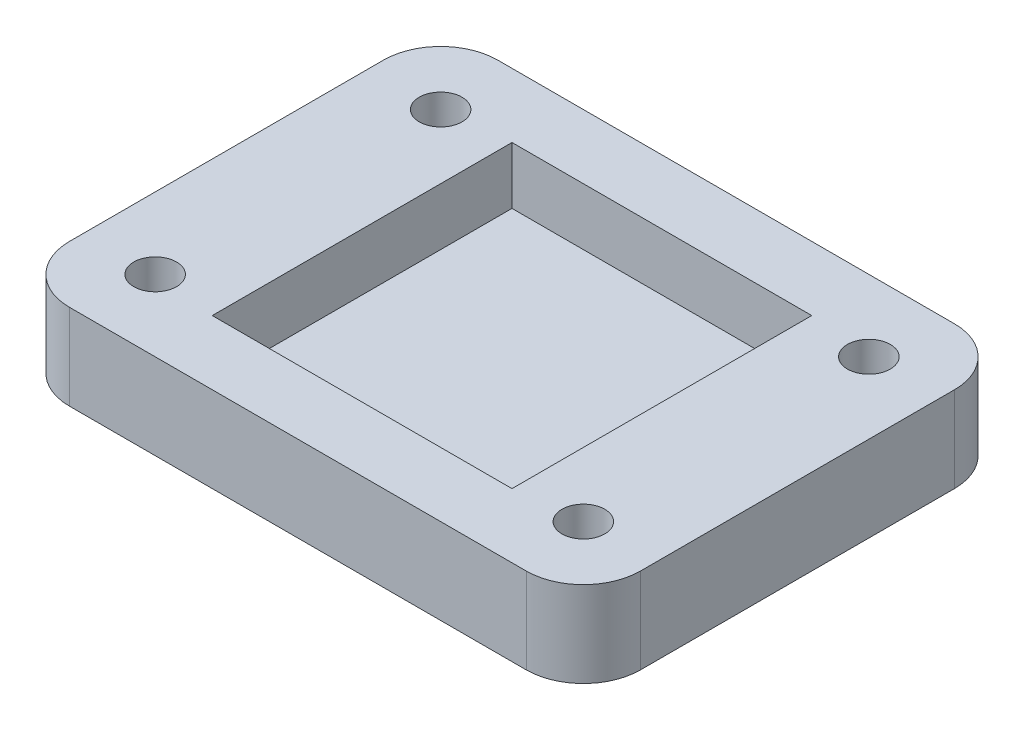
ISO-10303-21;
HEADER;
FILE_DESCRIPTION(('STEP AP214'),'2;1');
FILE_NAME('part.step','',(''),(''),'','','');
FILE_SCHEMA(('AUTOMOTIVE_DESIGN { 1 0 10303 214 1 1 1 1 }'));
ENDSEC;
DATA;
#1=APPLICATION_CONTEXT('core data for automotive mechanical design processes');
#2=APPLICATION_PROTOCOL_DEFINITION('international standard','automotive_design',2000,#1);
#3=PRODUCT_CONTEXT('',#1,'mechanical');
#4=PRODUCT('Part','Part','',(#3));
#5=PRODUCT_RELATED_PRODUCT_CATEGORY('part','',(#4));
#6=PRODUCT_DEFINITION_FORMATION('','',#4);
#7=PRODUCT_DEFINITION_CONTEXT('part definition',#1,'design');
#8=PRODUCT_DEFINITION('design','',#6,#7);
#9=PRODUCT_DEFINITION_SHAPE('','',#8);
#10=(LENGTH_UNIT() NAMED_UNIT(*) SI_UNIT(.MILLI.,.METRE.));
#11=(NAMED_UNIT(*) PLANE_ANGLE_UNIT() SI_UNIT($,.RADIAN.));
#12=(NAMED_UNIT(*) SI_UNIT($,.STERADIAN.) SOLID_ANGLE_UNIT());
#13=UNCERTAINTY_MEASURE_WITH_UNIT(LENGTH_MEASURE(1.E-05),#10,'distance_accuracy_value','');
#14=(GEOMETRIC_REPRESENTATION_CONTEXT(3) GLOBAL_UNCERTAINTY_ASSIGNED_CONTEXT((#13)) GLOBAL_UNIT_ASSIGNED_CONTEXT((#10,
#11,#12)) REPRESENTATION_CONTEXT('',''));
#15=CARTESIAN_POINT('',(0.,0.,0.));
#16=DIRECTION('',(0.,0.,1.));
#17=DIRECTION('',(1.,0.,0.));
#18=AXIS2_PLACEMENT_3D('',#15,#16,#17);
#19=CARTESIAN_POINT('',(0.,6.,0.));
#20=DIRECTION('',(1.,0.,0.));
#21=DIRECTION('',(0.,0.,-1.));
#22=AXIS2_PLACEMENT_3D('',#19,#20,#21);
#23=PLANE('',#22);
#24=DIRECTION('',(0.,0.,1.));
#25=VECTOR('',#24,1.);
#26=CARTESIAN_POINT('',(0.,6.,0.));
#27=LINE('',#26,#25);
#28=CARTESIAN_POINT('',(0.,6.,-26.));
#29=VERTEX_POINT('',#28);
#30=CARTESIAN_POINT('',(0.,6.,-4.));
#31=VERTEX_POINT('',#30);
#32=EDGE_CURVE('E186',#29,#31,#27,.T.);
#33=ORIENTED_EDGE('',*,*,#32,.F.);
#34=DIRECTION('',(0.,-1.,0.));
#35=VECTOR('',#34,1.);
#36=CARTESIAN_POINT('',(0.,6.,-26.));
#37=LINE('',#36,#35);
#38=CARTESIAN_POINT('',(0.,0.,-26.));
#39=VERTEX_POINT('',#38);
#40=EDGE_CURVE('E209',#29,#39,#37,.T.);
#41=ORIENTED_EDGE('',*,*,#40,.T.);
#42=DIRECTION('',(0.,0.,1.));
#43=VECTOR('',#42,1.);
#44=CARTESIAN_POINT('',(0.,0.,0.));
#45=LINE('',#44,#43);
#46=CARTESIAN_POINT('',(0.,0.,-4.));
#47=VERTEX_POINT('',#46);
#48=EDGE_CURVE('E185',#39,#47,#45,.T.);
#49=ORIENTED_EDGE('',*,*,#48,.T.);
#50=DIRECTION('',(0.,-1.,0.));
#51=VECTOR('',#50,1.);
#52=CARTESIAN_POINT('',(0.,6.,-4.));
#53=LINE('',#52,#51);
#54=EDGE_CURVE('E198',#47,#31,#53,.F.);
#55=ORIENTED_EDGE('',*,*,#54,.T.);
#56=EDGE_LOOP('',(#33,#41,#49,#55));
#57=FACE_BOUND('',#56,.T.);
#58=ADVANCED_FACE('F33',(#57),#23,.F.);
#59=CARTESIAN_POINT('',(0.,6.,0.));
#60=DIRECTION('',(0.,0.,-1.));
#61=DIRECTION('',(-1.,0.,0.));
#62=AXIS2_PLACEMENT_3D('',#59,#60,#61);
#63=PLANE('',#62);
#64=DIRECTION('',(1.,0.,0.));
#65=VECTOR('',#64,1.);
#66=CARTESIAN_POINT('',(0.,0.,0.));
#67=LINE('',#66,#65);
#68=CARTESIAN_POINT('',(4.,0.,0.));
#69=VERTEX_POINT('',#68);
#70=CARTESIAN_POINT('',(36.,0.,0.));
#71=VERTEX_POINT('',#70);
#72=EDGE_CURVE('E201',#69,#71,#67,.T.);
#73=ORIENTED_EDGE('',*,*,#72,.T.);
#74=DIRECTION('',(0.,-1.,0.));
#75=VECTOR('',#74,1.);
#76=CARTESIAN_POINT('',(36.,6.,0.));
#77=LINE('',#76,#75);
#78=CARTESIAN_POINT('',(36.,6.,0.));
#79=VERTEX_POINT('',#78);
#80=EDGE_CURVE('E11',#71,#79,#77,.F.);
#81=ORIENTED_EDGE('',*,*,#80,.T.);
#82=DIRECTION('',(1.,0.,0.));
#83=VECTOR('',#82,1.);
#84=CARTESIAN_POINT('',(0.,6.,0.));
#85=LINE('',#84,#83);
#86=CARTESIAN_POINT('',(4.,6.,0.));
#87=VERTEX_POINT('',#86);
#88=EDGE_CURVE('E189',#87,#79,#85,.T.);
#89=ORIENTED_EDGE('',*,*,#88,.F.);
#90=DIRECTION('',(0.,-1.,0.));
#91=VECTOR('',#90,1.);
#92=CARTESIAN_POINT('',(4.,6.,0.));
#93=LINE('',#92,#91);
#94=EDGE_CURVE('E41',#87,#69,#93,.T.);
#95=ORIENTED_EDGE('',*,*,#94,.T.);
#96=EDGE_LOOP('',(#73,#81,#89,#95));
#97=FACE_BOUND('',#96,.T.);
#98=ADVANCED_FACE('F241',(#97),#63,.F.);
#99=CARTESIAN_POINT('',(40.,6.,0.));
#100=DIRECTION('',(-1.,0.,0.));
#101=DIRECTION('',(0.,0.,1.));
#102=AXIS2_PLACEMENT_3D('',#99,#100,#101);
#103=PLANE('',#102);
#104=DIRECTION('',(0.,0.,-1.));
#105=VECTOR('',#104,1.);
#106=CARTESIAN_POINT('',(40.,0.,0.));
#107=LINE('',#106,#105);
#108=CARTESIAN_POINT('',(40.,0.,-4.));
#109=VERTEX_POINT('',#108);
#110=CARTESIAN_POINT('',(40.,0.,-26.));
#111=VERTEX_POINT('',#110);
#112=EDGE_CURVE('E204',#109,#111,#107,.T.);
#113=ORIENTED_EDGE('',*,*,#112,.T.);
#114=DIRECTION('',(0.,-1.,0.));
#115=VECTOR('',#114,1.);
#116=CARTESIAN_POINT('',(40.,6.,-26.));
#117=LINE('',#116,#115);
#118=CARTESIAN_POINT('',(40.,6.,-26.));
#119=VERTEX_POINT('',#118);
#120=EDGE_CURVE('E56',#111,#119,#117,.F.);
#121=ORIENTED_EDGE('',*,*,#120,.T.);
#122=DIRECTION('',(0.,0.,-1.));
#123=VECTOR('',#122,1.);
#124=CARTESIAN_POINT('',(40.,6.,0.));
#125=LINE('',#124,#123);
#126=CARTESIAN_POINT('',(40.,6.,-4.));
#127=VERTEX_POINT('',#126);
#128=EDGE_CURVE('E193',#127,#119,#125,.T.);
#129=ORIENTED_EDGE('',*,*,#128,.F.);
#130=DIRECTION('',(0.,-1.,0.));
#131=VECTOR('',#130,1.);
#132=CARTESIAN_POINT('',(40.,6.,-4.));
#133=LINE('',#132,#131);
#134=EDGE_CURVE('E233',#127,#109,#133,.T.);
#135=ORIENTED_EDGE('',*,*,#134,.T.);
#136=EDGE_LOOP('',(#113,#121,#129,#135));
#137=FACE_BOUND('',#136,.T.);
#138=ADVANCED_FACE('F253',(#137),#103,.F.);
#139=CARTESIAN_POINT('',(0.,6.,-30.));
#140=DIRECTION('',(0.,0.,1.));
#141=DIRECTION('',(1.,0.,0.));
#142=AXIS2_PLACEMENT_3D('',#139,#140,#141);
#143=PLANE('',#142);
#144=DIRECTION('',(-1.,0.,0.));
#145=VECTOR('',#144,1.);
#146=CARTESIAN_POINT('',(0.,0.,-30.));
#147=LINE('',#146,#145);
#148=CARTESIAN_POINT('',(36.,0.,-30.));
#149=VERTEX_POINT('',#148);
#150=CARTESIAN_POINT('',(4.,0.,-30.));
#151=VERTEX_POINT('',#150);
#152=EDGE_CURVE('E190',#149,#151,#147,.T.);
#153=ORIENTED_EDGE('',*,*,#152,.T.);
#154=DIRECTION('',(0.,-1.,0.));
#155=VECTOR('',#154,1.);
#156=CARTESIAN_POINT('',(4.,6.,-30.));
#157=LINE('',#156,#155);
#158=CARTESIAN_POINT('',(4.,6.,-30.));
#159=VERTEX_POINT('',#158);
#160=EDGE_CURVE('E223',#151,#159,#157,.F.);
#161=ORIENTED_EDGE('',*,*,#160,.T.);
#162=DIRECTION('',(-1.,0.,0.));
#163=VECTOR('',#162,1.);
#164=CARTESIAN_POINT('',(0.,6.,-30.));
#165=LINE('',#164,#163);
#166=CARTESIAN_POINT('',(36.,6.,-30.));
#167=VERTEX_POINT('',#166);
#168=EDGE_CURVE('E195',#167,#159,#165,.T.);
#169=ORIENTED_EDGE('',*,*,#168,.F.);
#170=DIRECTION('',(0.,-1.,0.));
#171=VECTOR('',#170,1.);
#172=CARTESIAN_POINT('',(36.,6.,-30.));
#173=LINE('',#172,#171);
#174=EDGE_CURVE('E220',#167,#149,#173,.T.);
#175=ORIENTED_EDGE('',*,*,#174,.T.);
#176=EDGE_LOOP('',(#153,#161,#169,#175));
#177=FACE_BOUND('',#176,.T.);
#178=ADVANCED_FACE('F263',(#177),#143,.F.);
#179=CARTESIAN_POINT('',(0.,6.,0.));
#180=DIRECTION('',(0.,-1.,0.));
#181=DIRECTION('',(0.,0.,-1.));
#182=AXIS2_PLACEMENT_3D('',#179,#180,#181);
#183=PLANE('',#182);
#184=DIRECTION('',(1.,0.,0.));
#185=VECTOR('',#184,1.);
#186=CARTESIAN_POINT('',(9.5,6.,-4.5));
#187=LINE('',#186,#185);
#188=CARTESIAN_POINT('',(9.5,6.,-4.5));
#189=VERTEX_POINT('',#188);
#190=CARTESIAN_POINT('',(30.5,6.,-4.5));
#191=VERTEX_POINT('',#190);
#192=EDGE_CURVE('E152',#189,#191,#187,.T.);
#193=ORIENTED_EDGE('',*,*,#192,.F.);
#194=DIRECTION('',(0.,0.,1.));
#195=VECTOR('',#194,1.);
#196=CARTESIAN_POINT('',(9.5,6.,-4.5));
#197=LINE('',#196,#195);
#198=CARTESIAN_POINT('',(9.5,6.,-25.5));
#199=VERTEX_POINT('',#198);
#200=EDGE_CURVE('E48',#199,#189,#197,.T.);
#201=ORIENTED_EDGE('',*,*,#200,.F.);
#202=DIRECTION('',(-1.,0.,0.));
#203=VECTOR('',#202,1.);
#204=CARTESIAN_POINT('',(9.5,6.,-25.5));
#205=LINE('',#204,#203);
#206=CARTESIAN_POINT('',(30.5,6.,-25.5));
#207=VERTEX_POINT('',#206);
#208=EDGE_CURVE('E143',#207,#199,#205,.T.);
#209=ORIENTED_EDGE('',*,*,#208,.F.);
#210=DIRECTION('',(0.,0.,-1.));
#211=VECTOR('',#210,1.);
#212=CARTESIAN_POINT('',(30.5,6.,-4.5));
#213=LINE('',#212,#211);
#214=EDGE_CURVE('E146',#191,#207,#213,.T.);
#215=ORIENTED_EDGE('',*,*,#214,.F.);
#216=EDGE_LOOP('',(#193,#201,#209,#215));
#217=FACE_BOUND('',#216,.T.);
#218=CARTESIAN_POINT('',(5.,6.,-25.));
#219=DIRECTION('',(0.,1.,0.));
#220=DIRECTION('',(0.,0.,-1.));
#221=AXIS2_PLACEMENT_3D('',#218,#219,#220);
#222=CIRCLE('',#221,1.5);
#223=CARTESIAN_POINT('',(5.,6.,-26.5));
#224=VERTEX_POINT('',#223);
#225=EDGE_CURVE('E162',#224,#224,#222,.T.);
#226=ORIENTED_EDGE('',*,*,#225,.F.);
#227=EDGE_LOOP('',(#226));
#228=FACE_BOUND('',#227,.T.);
#229=CARTESIAN_POINT('',(35.,6.,-5.));
#230=DIRECTION('',(0.,1.,0.));
#231=DIRECTION('',(0.,0.,-1.));
#232=AXIS2_PLACEMENT_3D('',#229,#230,#231);
#233=CIRCLE('',#232,1.5);
#234=CARTESIAN_POINT('',(35.,6.,-6.5));
#235=VERTEX_POINT('',#234);
#236=EDGE_CURVE('E170',#235,#235,#233,.T.);
#237=ORIENTED_EDGE('',*,*,#236,.F.);
#238=EDGE_LOOP('',(#237));
#239=FACE_BOUND('',#238,.T.);
#240=CARTESIAN_POINT('',(35.,6.,-25.));
#241=DIRECTION('',(0.,1.,0.));
#242=DIRECTION('',(0.,0.,1.));
#243=AXIS2_PLACEMENT_3D('',#240,#241,#242);
#244=CIRCLE('',#243,1.5);
#245=CARTESIAN_POINT('',(35.,6.,-23.5));
#246=VERTEX_POINT('',#245);
#247=EDGE_CURVE('E158',#246,#246,#244,.T.);
#248=ORIENTED_EDGE('',*,*,#247,.F.);
#249=EDGE_LOOP('',(#248));
#250=FACE_BOUND('',#249,.T.);
#251=CARTESIAN_POINT('',(5.,6.,-5.));
#252=DIRECTION('',(0.,1.,0.));
#253=DIRECTION('',(0.,0.,1.));
#254=AXIS2_PLACEMENT_3D('',#251,#252,#253);
#255=CIRCLE('',#254,1.5);
#256=CARTESIAN_POINT('',(5.,6.,-3.5));
#257=VERTEX_POINT('',#256);
#258=EDGE_CURVE('E169',#257,#257,#255,.T.);
#259=ORIENTED_EDGE('',*,*,#258,.F.);
#260=EDGE_LOOP('',(#259));
#261=FACE_BOUND('',#260,.T.);
#262=ORIENTED_EDGE('',*,*,#168,.T.);
#263=CARTESIAN_POINT('',(4.,6.,-26.));
#264=DIRECTION('',(0.,-1.,0.));
#265=DIRECTION('',(0.,0.,-1.));
#266=AXIS2_PLACEMENT_3D('',#263,#264,#265);
#267=CIRCLE('',#266,4.);
#268=EDGE_CURVE('E231',#159,#29,#267,.F.);
#269=ORIENTED_EDGE('',*,*,#268,.T.);
#270=ORIENTED_EDGE('',*,*,#32,.T.);
#271=CARTESIAN_POINT('',(4.,6.,-4.));
#272=DIRECTION('',(0.,-1.,0.));
#273=DIRECTION('',(0.,0.,-1.));
#274=AXIS2_PLACEMENT_3D('',#271,#272,#273);
#275=CIRCLE('',#274,4.);
#276=EDGE_CURVE('E225',#31,#87,#275,.F.);
#277=ORIENTED_EDGE('',*,*,#276,.T.);
#278=ORIENTED_EDGE('',*,*,#88,.T.);
#279=CARTESIAN_POINT('',(36.,6.,-4.));
#280=DIRECTION('',(0.,-1.,0.));
#281=DIRECTION('',(0.,0.,-1.));
#282=AXIS2_PLACEMENT_3D('',#279,#280,#281);
#283=CIRCLE('',#282,4.);
#284=EDGE_CURVE('E227',#79,#127,#283,.F.);
#285=ORIENTED_EDGE('',*,*,#284,.T.);
#286=ORIENTED_EDGE('',*,*,#128,.T.);
#287=CARTESIAN_POINT('',(36.,6.,-26.));
#288=DIRECTION('',(0.,-1.,0.));
#289=DIRECTION('',(0.,0.,-1.));
#290=AXIS2_PLACEMENT_3D('',#287,#288,#289);
#291=CIRCLE('',#290,4.);
#292=EDGE_CURVE('E229',#119,#167,#291,.F.);
#293=ORIENTED_EDGE('',*,*,#292,.T.);
#294=EDGE_LOOP('',(#262,#269,#270,#277,#278,#285,#286,#293));
#295=FACE_BOUND('',#294,.T.);
#296=ADVANCED_FACE('F256',(#217,#228,#239,#250,#261,#295),#183,.F.);
#297=CARTESIAN_POINT('',(0.,0.,0.));
#298=DIRECTION('',(0.,-1.,0.));
#299=DIRECTION('',(0.,0.,-1.));
#300=AXIS2_PLACEMENT_3D('',#297,#298,#299);
#301=PLANE('',#300);
#302=CARTESIAN_POINT('',(5.,0.,-25.));
#303=DIRECTION('',(0.,-1.,0.));
#304=DIRECTION('',(0.,0.,-1.));
#305=AXIS2_PLACEMENT_3D('',#302,#303,#304);
#306=CIRCLE('',#305,1.5);
#307=CARTESIAN_POINT('',(5.,0.,-26.5));
#308=VERTEX_POINT('',#307);
#309=EDGE_CURVE('E165',#308,#308,#306,.F.);
#310=ORIENTED_EDGE('',*,*,#309,.T.);
#311=EDGE_LOOP('',(#310));
#312=FACE_BOUND('',#311,.T.);
#313=CARTESIAN_POINT('',(35.,0.,-5.));
#314=DIRECTION('',(0.,-1.,0.));
#315=DIRECTION('',(0.,0.,-1.));
#316=AXIS2_PLACEMENT_3D('',#313,#314,#315);
#317=CIRCLE('',#316,1.5);
#318=CARTESIAN_POINT('',(35.,0.,-6.5));
#319=VERTEX_POINT('',#318);
#320=EDGE_CURVE('E166',#319,#319,#317,.F.);
#321=ORIENTED_EDGE('',*,*,#320,.T.);
#322=EDGE_LOOP('',(#321));
#323=FACE_BOUND('',#322,.T.);
#324=CARTESIAN_POINT('',(35.,0.,-25.));
#325=DIRECTION('',(0.,-1.,0.));
#326=DIRECTION('',(0.,0.,-1.));
#327=AXIS2_PLACEMENT_3D('',#324,#325,#326);
#328=CIRCLE('',#327,1.5);
#329=CARTESIAN_POINT('',(35.,0.,-26.5));
#330=VERTEX_POINT('',#329);
#331=EDGE_CURVE('E173',#330,#330,#328,.F.);
#332=ORIENTED_EDGE('',*,*,#331,.T.);
#333=EDGE_LOOP('',(#332));
#334=FACE_BOUND('',#333,.T.);
#335=CARTESIAN_POINT('',(5.,0.,-5.));
#336=DIRECTION('',(0.,-1.,0.));
#337=DIRECTION('',(0.,0.,-1.));
#338=AXIS2_PLACEMENT_3D('',#335,#336,#337);
#339=CIRCLE('',#338,1.5);
#340=CARTESIAN_POINT('',(5.,0.,-6.5));
#341=VERTEX_POINT('',#340);
#342=EDGE_CURVE('E182',#341,#341,#339,.F.);
#343=ORIENTED_EDGE('',*,*,#342,.T.);
#344=EDGE_LOOP('',(#343));
#345=FACE_BOUND('',#344,.T.);
#346=ORIENTED_EDGE('',*,*,#48,.F.);
#347=CARTESIAN_POINT('',(4.,0.,-26.));
#348=DIRECTION('',(0.,-1.,0.));
#349=DIRECTION('',(0.,0.,-1.));
#350=AXIS2_PLACEMENT_3D('',#347,#348,#349);
#351=CIRCLE('',#350,4.);
#352=EDGE_CURVE('E218',#39,#151,#351,.T.);
#353=ORIENTED_EDGE('',*,*,#352,.T.);
#354=ORIENTED_EDGE('',*,*,#152,.F.);
#355=CARTESIAN_POINT('',(36.,0.,-26.));
#356=DIRECTION('',(0.,-1.,0.));
#357=DIRECTION('',(0.,0.,-1.));
#358=AXIS2_PLACEMENT_3D('',#355,#356,#357);
#359=CIRCLE('',#358,4.);
#360=EDGE_CURVE('E216',#149,#111,#359,.T.);
#361=ORIENTED_EDGE('',*,*,#360,.T.);
#362=ORIENTED_EDGE('',*,*,#112,.F.);
#363=CARTESIAN_POINT('',(36.,0.,-4.));
#364=DIRECTION('',(0.,-1.,0.));
#365=DIRECTION('',(0.,0.,-1.));
#366=AXIS2_PLACEMENT_3D('',#363,#364,#365);
#367=CIRCLE('',#366,4.);
#368=EDGE_CURVE('E214',#109,#71,#367,.T.);
#369=ORIENTED_EDGE('',*,*,#368,.T.);
#370=ORIENTED_EDGE('',*,*,#72,.F.);
#371=CARTESIAN_POINT('',(4.,0.,-4.));
#372=DIRECTION('',(0.,-1.,0.));
#373=DIRECTION('',(0.,0.,-1.));
#374=AXIS2_PLACEMENT_3D('',#371,#372,#373);
#375=CIRCLE('',#374,4.);
#376=EDGE_CURVE('E212',#69,#47,#375,.T.);
#377=ORIENTED_EDGE('',*,*,#376,.T.);
#378=EDGE_LOOP('',(#346,#353,#354,#361,#362,#369,#370,#377));
#379=FACE_BOUND('',#378,.T.);
#380=ADVANCED_FACE('F247',(#312,#323,#334,#345,#379),#301,.T.);
#381=CARTESIAN_POINT('',(5.,-4.24264068711928,-5.));
#382=DIRECTION('',(0.,1.,0.));
#383=DIRECTION('',(0.,0.,1.));
#384=AXIS2_PLACEMENT_3D('',#381,#382,#383);
#385=CYLINDRICAL_SURFACE('',#384,1.5);
#386=ORIENTED_EDGE('',*,*,#258,.T.);
#387=EDGE_LOOP('',(#386));
#388=FACE_BOUND('',#387,.T.);
#389=ORIENTED_EDGE('',*,*,#342,.F.);
#390=EDGE_LOOP('',(#389));
#391=FACE_BOUND('',#390,.T.);
#392=ADVANCED_FACE('F372',(#388,#391),#385,.F.);
#393=CARTESIAN_POINT('',(35.,-4.24264068711928,-25.));
#394=DIRECTION('',(0.,1.,0.));
#395=DIRECTION('',(0.,0.,1.));
#396=AXIS2_PLACEMENT_3D('',#393,#394,#395);
#397=CYLINDRICAL_SURFACE('',#396,1.5);
#398=ORIENTED_EDGE('',*,*,#247,.T.);
#399=EDGE_LOOP('',(#398));
#400=FACE_BOUND('',#399,.T.);
#401=ORIENTED_EDGE('',*,*,#331,.F.);
#402=EDGE_LOOP('',(#401));
#403=FACE_BOUND('',#402,.T.);
#404=ADVANCED_FACE('F368',(#400,#403),#397,.F.);
#405=CARTESIAN_POINT('',(35.,-4.24264068711928,-5.));
#406=DIRECTION('',(0.,1.,0.));
#407=DIRECTION('',(0.,0.,1.));
#408=AXIS2_PLACEMENT_3D('',#405,#406,#407);
#409=CYLINDRICAL_SURFACE('',#408,1.5);
#410=ORIENTED_EDGE('',*,*,#236,.T.);
#411=EDGE_LOOP('',(#410));
#412=FACE_BOUND('',#411,.T.);
#413=ORIENTED_EDGE('',*,*,#320,.F.);
#414=EDGE_LOOP('',(#413));
#415=FACE_BOUND('',#414,.T.);
#416=ADVANCED_FACE('F364',(#412,#415),#409,.F.);
#417=CARTESIAN_POINT('',(5.,-4.24264068711928,-25.));
#418=DIRECTION('',(0.,1.,0.));
#419=DIRECTION('',(0.,0.,1.));
#420=AXIS2_PLACEMENT_3D('',#417,#418,#419);
#421=CYLINDRICAL_SURFACE('',#420,1.5);
#422=ORIENTED_EDGE('',*,*,#225,.T.);
#423=EDGE_LOOP('',(#422));
#424=FACE_BOUND('',#423,.T.);
#425=ORIENTED_EDGE('',*,*,#309,.F.);
#426=EDGE_LOOP('',(#425));
#427=FACE_BOUND('',#426,.T.);
#428=ADVANCED_FACE('F289',(#424,#427),#421,.F.);
#429=CARTESIAN_POINT('',(4.,6.,-26.));
#430=DIRECTION('',(0.,-1.,0.));
#431=DIRECTION('',(0.,0.,-1.));
#432=AXIS2_PLACEMENT_3D('',#429,#430,#431);
#433=CYLINDRICAL_SURFACE('',#432,4.);
#434=ORIENTED_EDGE('',*,*,#268,.F.);
#435=ORIENTED_EDGE('',*,*,#160,.F.);
#436=ORIENTED_EDGE('',*,*,#352,.F.);
#437=ORIENTED_EDGE('',*,*,#40,.F.);
#438=EDGE_LOOP('',(#434,#435,#436,#437));
#439=FACE_BOUND('',#438,.T.);
#440=ADVANCED_FACE('F268',(#439),#433,.T.);
#441=CARTESIAN_POINT('',(36.,6.,-26.));
#442=DIRECTION('',(0.,-1.,0.));
#443=DIRECTION('',(0.,0.,-1.));
#444=AXIS2_PLACEMENT_3D('',#441,#442,#443);
#445=CYLINDRICAL_SURFACE('',#444,4.);
#446=ORIENTED_EDGE('',*,*,#292,.F.);
#447=ORIENTED_EDGE('',*,*,#120,.F.);
#448=ORIENTED_EDGE('',*,*,#360,.F.);
#449=ORIENTED_EDGE('',*,*,#174,.F.);
#450=EDGE_LOOP('',(#446,#447,#448,#449));
#451=FACE_BOUND('',#450,.T.);
#452=ADVANCED_FACE('F260',(#451),#445,.T.);
#453=CARTESIAN_POINT('',(36.,6.,-4.));
#454=DIRECTION('',(0.,-1.,0.));
#455=DIRECTION('',(0.,0.,-1.));
#456=AXIS2_PLACEMENT_3D('',#453,#454,#455);
#457=CYLINDRICAL_SURFACE('',#456,4.);
#458=ORIENTED_EDGE('',*,*,#284,.F.);
#459=ORIENTED_EDGE('',*,*,#80,.F.);
#460=ORIENTED_EDGE('',*,*,#368,.F.);
#461=ORIENTED_EDGE('',*,*,#134,.F.);
#462=EDGE_LOOP('',(#458,#459,#460,#461));
#463=FACE_BOUND('',#462,.T.);
#464=ADVANCED_FACE('F252',(#463),#457,.T.);
#465=CARTESIAN_POINT('',(4.,6.,-4.));
#466=DIRECTION('',(0.,-1.,0.));
#467=DIRECTION('',(0.,0.,-1.));
#468=AXIS2_PLACEMENT_3D('',#465,#466,#467);
#469=CYLINDRICAL_SURFACE('',#468,4.);
#470=ORIENTED_EDGE('',*,*,#276,.F.);
#471=ORIENTED_EDGE('',*,*,#54,.F.);
#472=ORIENTED_EDGE('',*,*,#376,.F.);
#473=ORIENTED_EDGE('',*,*,#94,.F.);
#474=EDGE_LOOP('',(#470,#471,#472,#473));
#475=FACE_BOUND('',#474,.T.);
#476=ADVANCED_FACE('F35',(#475),#469,.T.);
#477=CARTESIAN_POINT('',(9.5,2.,-4.5));
#478=DIRECTION('',(-1.,0.,0.));
#479=DIRECTION('',(0.,0.,1.));
#480=AXIS2_PLACEMENT_3D('',#477,#478,#479);
#481=PLANE('',#480);
#482=ORIENTED_EDGE('',*,*,#200,.T.);
#483=DIRECTION('',(0.,1.,0.));
#484=VECTOR('',#483,1.);
#485=CARTESIAN_POINT('',(9.5,2.,-4.5));
#486=LINE('',#485,#484);
#487=CARTESIAN_POINT('',(9.5,2.,-4.5));
#488=VERTEX_POINT('',#487);
#489=EDGE_CURVE('E121',#488,#189,#486,.T.);
#490=ORIENTED_EDGE('',*,*,#489,.F.);
#491=DIRECTION('',(0.,0.,1.));
#492=VECTOR('',#491,1.);
#493=CARTESIAN_POINT('',(9.5,2.,-4.5));
#494=LINE('',#493,#492);
#495=CARTESIAN_POINT('',(9.5,2.,-25.5));
#496=VERTEX_POINT('',#495);
#497=EDGE_CURVE('E125',#496,#488,#494,.T.);
#498=ORIENTED_EDGE('',*,*,#497,.F.);
#499=DIRECTION('',(0.,1.,0.));
#500=VECTOR('',#499,1.);
#501=CARTESIAN_POINT('',(9.5,2.,-25.5));
#502=LINE('',#501,#500);
#503=EDGE_CURVE('E156',#496,#199,#502,.T.);
#504=ORIENTED_EDGE('',*,*,#503,.T.);
#505=EDGE_LOOP('',(#482,#490,#498,#504));
#506=FACE_BOUND('',#505,.T.);
#507=ADVANCED_FACE('F123',(#506),#481,.F.);
#508=CARTESIAN_POINT('',(9.5,2.,-25.5));
#509=DIRECTION('',(0.,0.,-1.));
#510=DIRECTION('',(-1.,0.,0.));
#511=AXIS2_PLACEMENT_3D('',#508,#509,#510);
#512=PLANE('',#511);
#513=ORIENTED_EDGE('',*,*,#208,.T.);
#514=ORIENTED_EDGE('',*,*,#503,.F.);
#515=DIRECTION('',(-1.,0.,0.));
#516=VECTOR('',#515,1.);
#517=CARTESIAN_POINT('',(9.5,2.,-25.5));
#518=LINE('',#517,#516);
#519=CARTESIAN_POINT('',(30.5,2.,-25.5));
#520=VERTEX_POINT('',#519);
#521=EDGE_CURVE('E131',#520,#496,#518,.T.);
#522=ORIENTED_EDGE('',*,*,#521,.F.);
#523=DIRECTION('',(0.,1.,0.));
#524=VECTOR('',#523,1.);
#525=CARTESIAN_POINT('',(30.5,2.,-25.5));
#526=LINE('',#525,#524);
#527=EDGE_CURVE('E159',#520,#207,#526,.T.);
#528=ORIENTED_EDGE('',*,*,#527,.T.);
#529=EDGE_LOOP('',(#513,#514,#522,#528));
#530=FACE_BOUND('',#529,.T.);
#531=ADVANCED_FACE('F277',(#530),#512,.F.);
#532=CARTESIAN_POINT('',(30.5,2.,-4.5));
#533=DIRECTION('',(1.,0.,0.));
#534=DIRECTION('',(0.,0.,-1.));
#535=AXIS2_PLACEMENT_3D('',#532,#533,#534);
#536=PLANE('',#535);
#537=ORIENTED_EDGE('',*,*,#214,.T.);
#538=ORIENTED_EDGE('',*,*,#527,.F.);
#539=DIRECTION('',(0.,0.,-1.));
#540=VECTOR('',#539,1.);
#541=CARTESIAN_POINT('',(30.5,2.,-4.5));
#542=LINE('',#541,#540);
#543=CARTESIAN_POINT('',(30.5,2.,-4.5));
#544=VERTEX_POINT('',#543);
#545=EDGE_CURVE('E139',#544,#520,#542,.T.);
#546=ORIENTED_EDGE('',*,*,#545,.F.);
#547=DIRECTION('',(0.,1.,0.));
#548=VECTOR('',#547,1.);
#549=CARTESIAN_POINT('',(30.5,2.,-4.5));
#550=LINE('',#549,#548);
#551=EDGE_CURVE('E130',#544,#191,#550,.T.);
#552=ORIENTED_EDGE('',*,*,#551,.T.);
#553=EDGE_LOOP('',(#537,#538,#546,#552));
#554=FACE_BOUND('',#553,.T.);
#555=ADVANCED_FACE('F332',(#554),#536,.F.);
#556=CARTESIAN_POINT('',(9.5,2.,-4.5));
#557=DIRECTION('',(0.,0.,1.));
#558=DIRECTION('',(1.,0.,0.));
#559=AXIS2_PLACEMENT_3D('',#556,#557,#558);
#560=PLANE('',#559);
#561=ORIENTED_EDGE('',*,*,#192,.T.);
#562=ORIENTED_EDGE('',*,*,#551,.F.);
#563=DIRECTION('',(1.,0.,0.));
#564=VECTOR('',#563,1.);
#565=CARTESIAN_POINT('',(9.5,2.,-4.5));
#566=LINE('',#565,#564);
#567=EDGE_CURVE('E134',#488,#544,#566,.T.);
#568=ORIENTED_EDGE('',*,*,#567,.F.);
#569=ORIENTED_EDGE('',*,*,#489,.T.);
#570=EDGE_LOOP('',(#561,#562,#568,#569));
#571=FACE_BOUND('',#570,.T.);
#572=ADVANCED_FACE('F135',(#571),#560,.F.);
#573=CARTESIAN_POINT('',(0.,2.,0.));
#574=DIRECTION('',(0.,-1.,0.));
#575=DIRECTION('',(0.,0.,-1.));
#576=AXIS2_PLACEMENT_3D('',#573,#574,#575);
#577=PLANE('',#576);
#578=ORIENTED_EDGE('',*,*,#497,.T.);
#579=ORIENTED_EDGE('',*,*,#567,.T.);
#580=ORIENTED_EDGE('',*,*,#545,.T.);
#581=ORIENTED_EDGE('',*,*,#521,.T.);
#582=EDGE_LOOP('',(#578,#579,#580,#581));
#583=FACE_BOUND('',#582,.T.);
#584=ADVANCED_FACE('F141',(#583),#577,.F.);
#585=CLOSED_SHELL('',(#58,#98,#138,#178,#296,#380,#392,#404,#416,#428,#440,#452,#464,#476,#507,
#531,#555,#572,#584));
#586=MANIFOLD_SOLID_BREP('B2',#585);
#587=ADVANCED_BREP_SHAPE_REPRESENTATION('',(#18,#586),#14);
#588=SHAPE_DEFINITION_REPRESENTATION(#9,#587);
ENDSEC;
END-ISO-10303-21;
